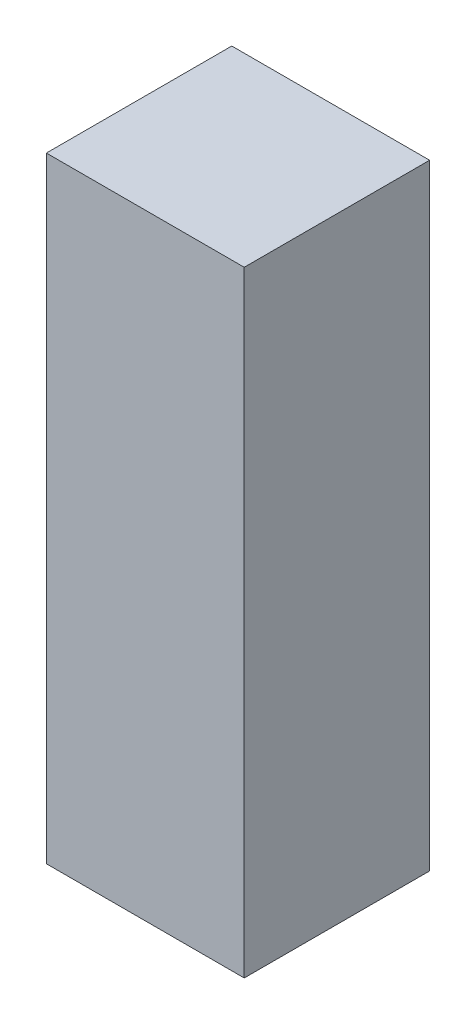
ISO-10303-21;
HEADER;
FILE_DESCRIPTION(('STEP AP214'),'2;1');
FILE_NAME('part.step','',(''),(''),'','','');
FILE_SCHEMA(('AUTOMOTIVE_DESIGN { 1 0 10303 214 1 1 1 1 }'));
ENDSEC;
DATA;
#1=APPLICATION_CONTEXT('core data for automotive mechanical design processes');
#2=APPLICATION_PROTOCOL_DEFINITION('international standard','automotive_design',2000,#1);
#3=PRODUCT_CONTEXT('',#1,'mechanical');
#4=PRODUCT('Part','Part','',(#3));
#5=PRODUCT_RELATED_PRODUCT_CATEGORY('part','',(#4));
#6=PRODUCT_DEFINITION_FORMATION('','',#4);
#7=PRODUCT_DEFINITION_CONTEXT('part definition',#1,'design');
#8=PRODUCT_DEFINITION('design','',#6,#7);
#9=PRODUCT_DEFINITION_SHAPE('','',#8);
#10=(LENGTH_UNIT() NAMED_UNIT(*) SI_UNIT(.MILLI.,.METRE.));
#11=(NAMED_UNIT(*) PLANE_ANGLE_UNIT() SI_UNIT($,.RADIAN.));
#12=(NAMED_UNIT(*) SI_UNIT($,.STERADIAN.) SOLID_ANGLE_UNIT());
#13=UNCERTAINTY_MEASURE_WITH_UNIT(LENGTH_MEASURE(1.E-05),#10,'distance_accuracy_value','');
#14=(GEOMETRIC_REPRESENTATION_CONTEXT(3) GLOBAL_UNCERTAINTY_ASSIGNED_CONTEXT((#13)) GLOBAL_UNIT_ASSIGNED_CONTEXT((#10,
#11,#12)) REPRESENTATION_CONTEXT('',''));
#15=CARTESIAN_POINT('',(0.,0.,0.));
#16=DIRECTION('',(0.,0.,1.));
#17=DIRECTION('',(1.,0.,0.));
#18=AXIS2_PLACEMENT_3D('',#15,#16,#17);
#19=CARTESIAN_POINT('',(0.,106.68,0.));
#20=DIRECTION('',(1.,0.,0.));
#21=DIRECTION('',(0.,0.,-1.));
#22=AXIS2_PLACEMENT_3D('',#19,#20,#21);
#23=PLANE('',#22);
#24=DIRECTION('',(0.,0.,1.));
#25=VECTOR('',#24,1.);
#26=CARTESIAN_POINT('',(0.,0.,0.));
#27=LINE('',#26,#25);
#28=CARTESIAN_POINT('',(0.,0.,-32.131));
#29=VERTEX_POINT('',#28);
#30=CARTESIAN_POINT('',(0.,0.,0.));
#31=VERTEX_POINT('',#30);
#32=EDGE_CURVE('E110',#29,#31,#27,.T.);
#33=ORIENTED_EDGE('',*,*,#32,.T.);
#34=DIRECTION('',(0.,-1.,0.));
#35=VECTOR('',#34,1.);
#36=CARTESIAN_POINT('',(0.,106.68,0.));
#37=LINE('',#36,#35);
#38=CARTESIAN_POINT('',(0.,106.68,0.));
#39=VERTEX_POINT('',#38);
#40=EDGE_CURVE('E11',#39,#31,#37,.T.);
#41=ORIENTED_EDGE('',*,*,#40,.F.);
#42=DIRECTION('',(0.,0.,1.));
#43=VECTOR('',#42,1.);
#44=CARTESIAN_POINT('',(0.,106.68,0.));
#45=LINE('',#44,#43);
#46=CARTESIAN_POINT('',(0.,106.68,-32.131));
#47=VERTEX_POINT('',#46);
#48=EDGE_CURVE('E94',#47,#39,#45,.T.);
#49=ORIENTED_EDGE('',*,*,#48,.F.);
#50=DIRECTION('',(0.,-1.,0.));
#51=VECTOR('',#50,1.);
#52=CARTESIAN_POINT('',(0.,106.68,-32.131));
#53=LINE('',#52,#51);
#54=EDGE_CURVE('E106',#47,#29,#53,.T.);
#55=ORIENTED_EDGE('',*,*,#54,.T.);
#56=EDGE_LOOP('',(#33,#41,#49,#55));
#57=FACE_BOUND('',#56,.T.);
#58=ADVANCED_FACE('F42',(#57),#23,.F.);
#59=CARTESIAN_POINT('',(0.,106.68,0.));
#60=DIRECTION('',(0.,0.,-1.));
#61=DIRECTION('',(-1.,0.,0.));
#62=AXIS2_PLACEMENT_3D('',#59,#60,#61);
#63=PLANE('',#62);
#64=DIRECTION('',(1.,0.,0.));
#65=VECTOR('',#64,1.);
#66=CARTESIAN_POINT('',(0.,0.,0.));
#67=LINE('',#66,#65);
#68=CARTESIAN_POINT('',(34.29,0.,0.));
#69=VERTEX_POINT('',#68);
#70=EDGE_CURVE('E99',#31,#69,#67,.T.);
#71=ORIENTED_EDGE('',*,*,#70,.T.);
#72=DIRECTION('',(0.,-1.,0.));
#73=VECTOR('',#72,1.);
#74=CARTESIAN_POINT('',(34.29,106.68,0.));
#75=LINE('',#74,#73);
#76=CARTESIAN_POINT('',(34.29,106.68,0.));
#77=VERTEX_POINT('',#76);
#78=EDGE_CURVE('E51',#77,#69,#75,.T.);
#79=ORIENTED_EDGE('',*,*,#78,.F.);
#80=DIRECTION('',(1.,0.,0.));
#81=VECTOR('',#80,1.);
#82=CARTESIAN_POINT('',(0.,106.68,0.));
#83=LINE('',#82,#81);
#84=EDGE_CURVE('E89',#39,#77,#83,.T.);
#85=ORIENTED_EDGE('',*,*,#84,.F.);
#86=ORIENTED_EDGE('',*,*,#40,.T.);
#87=EDGE_LOOP('',(#71,#79,#85,#86));
#88=FACE_BOUND('',#87,.T.);
#89=ADVANCED_FACE('F98',(#88),#63,.F.);
#90=CARTESIAN_POINT('',(34.29,106.68,0.));
#91=DIRECTION('',(-1.,0.,0.));
#92=DIRECTION('',(0.,0.,1.));
#93=AXIS2_PLACEMENT_3D('',#90,#91,#92);
#94=PLANE('',#93);
#95=DIRECTION('',(0.,0.,-1.));
#96=VECTOR('',#95,1.);
#97=CARTESIAN_POINT('',(34.29,0.,0.));
#98=LINE('',#97,#96);
#99=CARTESIAN_POINT('',(34.29,0.,-32.131));
#100=VERTEX_POINT('',#99);
#101=EDGE_CURVE('E76',#69,#100,#98,.T.);
#102=ORIENTED_EDGE('',*,*,#101,.T.);
#103=DIRECTION('',(0.,-1.,0.));
#104=VECTOR('',#103,1.);
#105=CARTESIAN_POINT('',(34.29,106.68,-32.131));
#106=LINE('',#105,#104);
#107=CARTESIAN_POINT('',(34.29,106.68,-32.131));
#108=VERTEX_POINT('',#107);
#109=EDGE_CURVE('E101',#108,#100,#106,.T.);
#110=ORIENTED_EDGE('',*,*,#109,.F.);
#111=DIRECTION('',(0.,0.,-1.));
#112=VECTOR('',#111,1.);
#113=CARTESIAN_POINT('',(34.29,106.68,0.));
#114=LINE('',#113,#112);
#115=EDGE_CURVE('E92',#77,#108,#114,.T.);
#116=ORIENTED_EDGE('',*,*,#115,.F.);
#117=ORIENTED_EDGE('',*,*,#78,.T.);
#118=EDGE_LOOP('',(#102,#110,#116,#117));
#119=FACE_BOUND('',#118,.T.);
#120=ADVANCED_FACE('F102',(#119),#94,.F.);
#121=CARTESIAN_POINT('',(0.,106.68,-32.131));
#122=DIRECTION('',(0.,0.,1.));
#123=DIRECTION('',(1.,0.,0.));
#124=AXIS2_PLACEMENT_3D('',#121,#122,#123);
#125=PLANE('',#124);
#126=DIRECTION('',(-1.,0.,0.));
#127=VECTOR('',#126,1.);
#128=CARTESIAN_POINT('',(0.,0.,-32.131));
#129=LINE('',#128,#127);
#130=EDGE_CURVE('E82',#100,#29,#129,.T.);
#131=ORIENTED_EDGE('',*,*,#130,.T.);
#132=ORIENTED_EDGE('',*,*,#54,.F.);
#133=DIRECTION('',(-1.,0.,0.));
#134=VECTOR('',#133,1.);
#135=CARTESIAN_POINT('',(0.,106.68,-32.131));
#136=LINE('',#135,#134);
#137=EDGE_CURVE('E59',#108,#47,#136,.T.);
#138=ORIENTED_EDGE('',*,*,#137,.F.);
#139=ORIENTED_EDGE('',*,*,#109,.T.);
#140=EDGE_LOOP('',(#131,#132,#138,#139));
#141=FACE_BOUND('',#140,.T.);
#142=ADVANCED_FACE('F123',(#141),#125,.F.);
#143=CARTESIAN_POINT('',(0.,106.68,0.));
#144=DIRECTION('',(0.,-1.,0.));
#145=DIRECTION('',(0.,0.,-1.));
#146=AXIS2_PLACEMENT_3D('',#143,#144,#145);
#147=PLANE('',#146);
#148=ORIENTED_EDGE('',*,*,#48,.T.);
#149=ORIENTED_EDGE('',*,*,#84,.T.);
#150=ORIENTED_EDGE('',*,*,#115,.T.);
#151=ORIENTED_EDGE('',*,*,#137,.T.);
#152=EDGE_LOOP('',(#148,#149,#150,#151));
#153=FACE_BOUND('',#152,.T.);
#154=ADVANCED_FACE('F90',(#153),#147,.F.);
#155=CARTESIAN_POINT('',(0.,0.,0.));
#156=DIRECTION('',(0.,-1.,0.));
#157=DIRECTION('',(0.,0.,-1.));
#158=AXIS2_PLACEMENT_3D('',#155,#156,#157);
#159=PLANE('',#158);
#160=ORIENTED_EDGE('',*,*,#32,.F.);
#161=ORIENTED_EDGE('',*,*,#130,.F.);
#162=ORIENTED_EDGE('',*,*,#101,.F.);
#163=ORIENTED_EDGE('',*,*,#70,.F.);
#164=EDGE_LOOP('',(#160,#161,#162,#163));
#165=FACE_BOUND('',#164,.T.);
#166=ADVANCED_FACE('F126',(#165),#159,.T.);
#167=CLOSED_SHELL('',(#58,#89,#120,#142,#154,#166));
#168=MANIFOLD_SOLID_BREP('B2',#167);
#169=ADVANCED_BREP_SHAPE_REPRESENTATION('',(#18,#168),#14);
#170=SHAPE_DEFINITION_REPRESENTATION(#9,#169);
ENDSEC;
END-ISO-10303-21;
